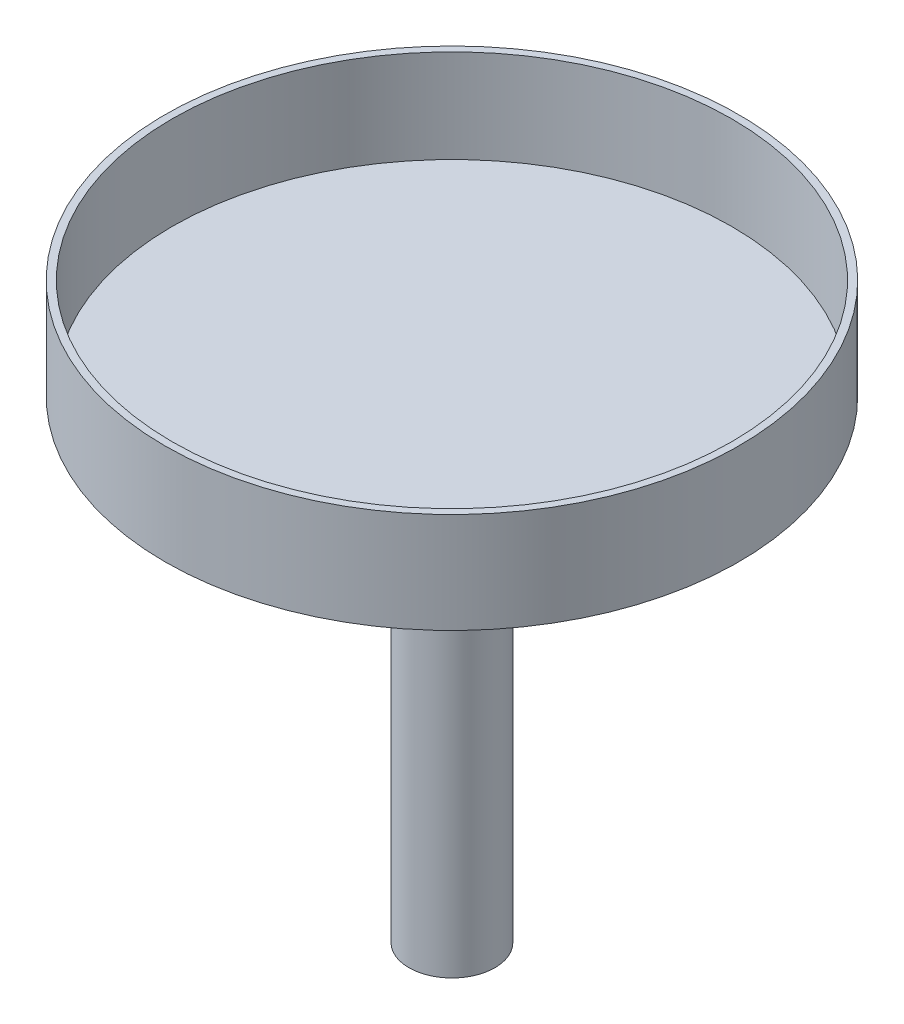
ISO-10303-21;
HEADER;
FILE_DESCRIPTION(('STEP AP214'),'2;1');
FILE_NAME('part.step','',(''),(''),'','','');
FILE_SCHEMA(('AUTOMOTIVE_DESIGN { 1 0 10303 214 1 1 1 1 }'));
ENDSEC;
DATA;
#1=APPLICATION_CONTEXT('core data for automotive mechanical design processes');
#2=APPLICATION_PROTOCOL_DEFINITION('international standard','automotive_design',2000,#1);
#3=PRODUCT_CONTEXT('',#1,'mechanical');
#4=PRODUCT('Part','Part','',(#3));
#5=PRODUCT_RELATED_PRODUCT_CATEGORY('part','',(#4));
#6=PRODUCT_DEFINITION_FORMATION('','',#4);
#7=PRODUCT_DEFINITION_CONTEXT('part definition',#1,'design');
#8=PRODUCT_DEFINITION('design','',#6,#7);
#9=PRODUCT_DEFINITION_SHAPE('','',#8);
#10=(LENGTH_UNIT() NAMED_UNIT(*) SI_UNIT(.MILLI.,.METRE.));
#11=(NAMED_UNIT(*) PLANE_ANGLE_UNIT() SI_UNIT($,.RADIAN.));
#12=(NAMED_UNIT(*) SI_UNIT($,.STERADIAN.) SOLID_ANGLE_UNIT());
#13=UNCERTAINTY_MEASURE_WITH_UNIT(LENGTH_MEASURE(1.E-05),#10,'distance_accuracy_value','');
#14=(GEOMETRIC_REPRESENTATION_CONTEXT(3) GLOBAL_UNCERTAINTY_ASSIGNED_CONTEXT((#13)) GLOBAL_UNIT_ASSIGNED_CONTEXT((#10,
#11,#12)) REPRESENTATION_CONTEXT('',''));
#15=CARTESIAN_POINT('',(0.,0.,0.));
#16=DIRECTION('',(0.,0.,1.));
#17=DIRECTION('',(1.,0.,0.));
#18=AXIS2_PLACEMENT_3D('',#15,#16,#17);
#19=CARTESIAN_POINT('',(0.,-330.,0.));
#20=DIRECTION('',(0.,1.,0.));
#21=DIRECTION('',(0.,0.,1.));
#22=AXIS2_PLACEMENT_3D('',#19,#20,#21);
#23=PLANE('',#22);
#24=CARTESIAN_POINT('',(0.,-330.,0.));
#25=DIRECTION('',(0.,1.,0.));
#26=DIRECTION('',(0.,0.,1.));
#27=AXIS2_PLACEMENT_3D('',#24,#25,#26);
#28=CIRCLE('',#27,30.);
#29=CARTESIAN_POINT('',(0.,-330.,30.));
#30=VERTEX_POINT('',#29);
#31=EDGE_CURVE('E10',#30,#30,#28,.T.);
#32=ORIENTED_EDGE('',*,*,#31,.F.);
#33=EDGE_LOOP('',(#32));
#34=FACE_BOUND('',#33,.T.);
#35=ADVANCED_FACE('F37',(#34),#23,.F.);
#36=CARTESIAN_POINT('',(0.,34.7727272727273,0.));
#37=DIRECTION('',(0.,1.,0.));
#38=DIRECTION('',(0.,0.,1.));
#39=AXIS2_PLACEMENT_3D('',#36,#37,#38);
#40=CYLINDRICAL_SURFACE('',#39,30.);
#41=CARTESIAN_POINT('',(0.,0.,0.));
#42=DIRECTION('',(0.,1.,0.));
#43=DIRECTION('',(0.,0.,1.));
#44=AXIS2_PLACEMENT_3D('',#41,#42,#43);
#45=CIRCLE('',#44,30.);
#46=CARTESIAN_POINT('',(0.,0.,30.));
#47=VERTEX_POINT('',#46);
#48=EDGE_CURVE('E43',#47,#47,#45,.T.);
#49=ORIENTED_EDGE('',*,*,#48,.F.);
#50=EDGE_LOOP('',(#49));
#51=FACE_BOUND('',#50,.T.);
#52=ORIENTED_EDGE('',*,*,#31,.T.);
#53=EDGE_LOOP('',(#52));
#54=FACE_BOUND('',#53,.T.);
#55=ADVANCED_FACE('F85',(#51,#54),#40,.T.);
#56=CARTESIAN_POINT('',(30.,0.,0.));
#57=DIRECTION('',(0.,1.,0.));
#58=DIRECTION('',(0.,0.,1.));
#59=AXIS2_PLACEMENT_3D('',#56,#57,#58);
#60=PLANE('',#59);
#61=CARTESIAN_POINT('',(0.,0.,0.));
#62=DIRECTION('',(0.,1.,0.));
#63=DIRECTION('',(0.,0.,1.));
#64=AXIS2_PLACEMENT_3D('',#61,#62,#63);
#65=CIRCLE('',#64,200.);
#66=CARTESIAN_POINT('',(0.,0.,200.));
#67=VERTEX_POINT('',#66);
#68=EDGE_CURVE('E47',#67,#67,#65,.T.);
#69=ORIENTED_EDGE('',*,*,#68,.F.);
#70=EDGE_LOOP('',(#69));
#71=FACE_BOUND('',#70,.T.);
#72=ORIENTED_EDGE('',*,*,#48,.T.);
#73=EDGE_LOOP('',(#72));
#74=FACE_BOUND('',#73,.T.);
#75=ADVANCED_FACE('F80',(#71,#74),#60,.F.);
#76=CARTESIAN_POINT('',(0.,34.7727272727273,0.));
#77=DIRECTION('',(0.,1.,0.));
#78=DIRECTION('',(0.,0.,1.));
#79=AXIS2_PLACEMENT_3D('',#76,#77,#78);
#80=CYLINDRICAL_SURFACE('',#79,200.);
#81=CARTESIAN_POINT('',(0.,70.,0.));
#82=DIRECTION('',(0.,1.,0.));
#83=DIRECTION('',(0.,0.,1.));
#84=AXIS2_PLACEMENT_3D('',#81,#82,#83);
#85=CIRCLE('',#84,200.);
#86=CARTESIAN_POINT('',(0.,70.,200.));
#87=VERTEX_POINT('',#86);
#88=EDGE_CURVE('E51',#87,#87,#85,.T.);
#89=ORIENTED_EDGE('',*,*,#88,.F.);
#90=EDGE_LOOP('',(#89));
#91=FACE_BOUND('',#90,.T.);
#92=ORIENTED_EDGE('',*,*,#68,.T.);
#93=EDGE_LOOP('',(#92));
#94=FACE_BOUND('',#93,.T.);
#95=ADVANCED_FACE('F74',(#91,#94),#80,.T.);
#96=CARTESIAN_POINT('',(200.,70.,0.));
#97=DIRECTION('',(0.,-1.,0.));
#98=DIRECTION('',(0.,0.,-1.));
#99=AXIS2_PLACEMENT_3D('',#96,#97,#98);
#100=PLANE('',#99);
#101=CARTESIAN_POINT('',(0.,70.,0.));
#102=DIRECTION('',(0.,1.,0.));
#103=DIRECTION('',(0.,0.,1.));
#104=AXIS2_PLACEMENT_3D('',#101,#102,#103);
#105=CIRCLE('',#104,195.);
#106=CARTESIAN_POINT('',(0.,70.,195.));
#107=VERTEX_POINT('',#106);
#108=EDGE_CURVE('E56',#107,#107,#105,.T.);
#109=ORIENTED_EDGE('',*,*,#108,.F.);
#110=EDGE_LOOP('',(#109));
#111=FACE_BOUND('',#110,.T.);
#112=ORIENTED_EDGE('',*,*,#88,.T.);
#113=EDGE_LOOP('',(#112));
#114=FACE_BOUND('',#113,.T.);
#115=ADVANCED_FACE('F68',(#111,#114),#100,.F.);
#116=CARTESIAN_POINT('',(0.,34.7727272727273,0.));
#117=DIRECTION('',(0.,1.,0.));
#118=DIRECTION('',(0.,0.,1.));
#119=AXIS2_PLACEMENT_3D('',#116,#117,#118);
#120=CYLINDRICAL_SURFACE('',#119,195.);
#121=CARTESIAN_POINT('',(0.,5.00000000000002,0.));
#122=DIRECTION('',(0.,1.,0.));
#123=DIRECTION('',(0.,0.,1.));
#124=AXIS2_PLACEMENT_3D('',#121,#122,#123);
#125=CIRCLE('',#124,195.);
#126=CARTESIAN_POINT('',(0.,5.00000000000002,195.));
#127=VERTEX_POINT('',#126);
#128=EDGE_CURVE('E59',#127,#127,#125,.T.);
#129=ORIENTED_EDGE('',*,*,#128,.F.);
#130=EDGE_LOOP('',(#129));
#131=FACE_BOUND('',#130,.T.);
#132=ORIENTED_EDGE('',*,*,#108,.T.);
#133=EDGE_LOOP('',(#132));
#134=FACE_BOUND('',#133,.T.);
#135=ADVANCED_FACE('F65',(#131,#134),#120,.F.);
#136=CARTESIAN_POINT('',(195.,5.00000000000001,0.));
#137=DIRECTION('',(0.,-1.,0.));
#138=DIRECTION('',(0.,0.,-1.));
#139=AXIS2_PLACEMENT_3D('',#136,#137,#138);
#140=PLANE('',#139);
#141=ORIENTED_EDGE('',*,*,#128,.T.);
#142=EDGE_LOOP('',(#141));
#143=FACE_BOUND('',#142,.T.);
#144=ADVANCED_FACE('F63',(#143),#140,.F.);
#145=CLOSED_SHELL('',(#35,#55,#75,#95,#115,#135,#144));
#146=MANIFOLD_SOLID_BREP('B2',#145);
#147=ADVANCED_BREP_SHAPE_REPRESENTATION('',(#18,#146),#14);
#148=SHAPE_DEFINITION_REPRESENTATION(#9,#147);
ENDSEC;
END-ISO-10303-21;
